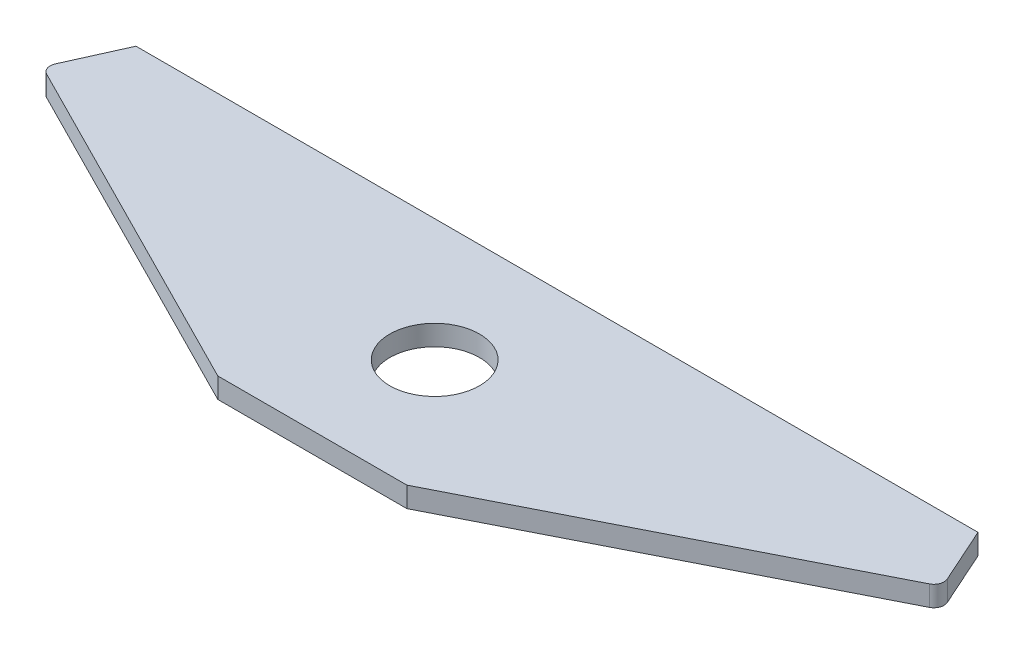
ISO-10303-21;
HEADER;
FILE_DESCRIPTION(('STEP AP214'),'2;1');
FILE_NAME('part.step','',(''),(''),'','','');
FILE_SCHEMA(('AUTOMOTIVE_DESIGN { 1 0 10303 214 1 1 1 1 }'));
ENDSEC;
DATA;
#1=APPLICATION_CONTEXT('core data for automotive mechanical design processes');
#2=APPLICATION_PROTOCOL_DEFINITION('international standard','automotive_design',2000,#1);
#3=PRODUCT_CONTEXT('',#1,'mechanical');
#4=PRODUCT('Part','Part','',(#3));
#5=PRODUCT_RELATED_PRODUCT_CATEGORY('part','',(#4));
#6=PRODUCT_DEFINITION_FORMATION('','',#4);
#7=PRODUCT_DEFINITION_CONTEXT('part definition',#1,'design');
#8=PRODUCT_DEFINITION('design','',#6,#7);
#9=PRODUCT_DEFINITION_SHAPE('','',#8);
#10=(LENGTH_UNIT() NAMED_UNIT(*) SI_UNIT(.MILLI.,.METRE.));
#11=(NAMED_UNIT(*) PLANE_ANGLE_UNIT() SI_UNIT($,.RADIAN.));
#12=(NAMED_UNIT(*) SI_UNIT($,.STERADIAN.) SOLID_ANGLE_UNIT());
#13=UNCERTAINTY_MEASURE_WITH_UNIT(LENGTH_MEASURE(1.E-05),#10,'distance_accuracy_value','');
#14=(GEOMETRIC_REPRESENTATION_CONTEXT(3) GLOBAL_UNCERTAINTY_ASSIGNED_CONTEXT((#13)) GLOBAL_UNIT_ASSIGNED_CONTEXT((#10,
#11,#12)) REPRESENTATION_CONTEXT('',''));
#15=CARTESIAN_POINT('',(0.,0.,0.));
#16=DIRECTION('',(0.,0.,1.));
#17=DIRECTION('',(1.,0.,0.));
#18=AXIS2_PLACEMENT_3D('',#15,#16,#17);
#19=CARTESIAN_POINT('',(224.059047254365,10.,-44.1090575008316));
#20=DIRECTION('',(-0.912159180043909,0.,0.409836101706065));
#21=DIRECTION('',(0.409836101706065,0.,0.912159180043909));
#22=AXIS2_PLACEMENT_3D('',#19,#20,#21);
#23=PLANE('',#22);
#24=DIRECTION('',(-0.409836101706065,0.,-0.912159180043909));
#25=VECTOR('',#24,1.);
#26=CARTESIAN_POINT('',(224.059047254365,0.,-44.1090575008316));
#27=LINE('',#26,#25);
#28=CARTESIAN_POINT('',(236.331683544147,0.,-16.7942411426233));
#29=VERTEX_POINT('',#28);
#30=CARTESIAN_POINT('',(224.059047254365,0.,-44.1090575008316));
#31=VERTEX_POINT('',#30);
#32=EDGE_CURVE('E128',#29,#31,#27,.T.);
#33=ORIENTED_EDGE('',*,*,#32,.T.);
#34=DIRECTION('',(0.,-1.,0.));
#35=VECTOR('',#34,1.);
#36=CARTESIAN_POINT('',(224.059047254365,10.,-44.1090575008316));
#37=LINE('',#36,#35);
#38=CARTESIAN_POINT('',(224.059047254365,10.,-44.1090575008316));
#39=VERTEX_POINT('',#38);
#40=EDGE_CURVE('E11',#39,#31,#37,.T.);
#41=ORIENTED_EDGE('',*,*,#40,.F.);
#42=DIRECTION('',(-0.409836101706065,0.,-0.912159180043909));
#43=VECTOR('',#42,1.);
#44=CARTESIAN_POINT('',(224.059047254365,10.,-44.1090575008316));
#45=LINE('',#44,#43);
#46=CARTESIAN_POINT('',(236.331683544147,10.,-16.7942411426233));
#47=VERTEX_POINT('',#46);
#48=EDGE_CURVE('E144',#47,#39,#45,.T.);
#49=ORIENTED_EDGE('',*,*,#48,.F.);
#50=DIRECTION('',(0.,-1.,0.));
#51=VECTOR('',#50,1.);
#52=CARTESIAN_POINT('',(236.331683544147,10.,-16.7942411426233));
#53=LINE('',#52,#51);
#54=EDGE_CURVE('E124',#47,#29,#53,.T.);
#55=ORIENTED_EDGE('',*,*,#54,.T.);
#56=EDGE_LOOP('',(#33,#41,#49,#55));
#57=FACE_BOUND('',#56,.T.);
#58=ADVANCED_FACE('F33',(#57),#23,.F.);
#59=CARTESIAN_POINT('',(224.059047254365,10.,-44.1090575008316));
#60=DIRECTION('',(0.,0.,1.));
#61=DIRECTION('',(1.,0.,0.));
#62=AXIS2_PLACEMENT_3D('',#59,#60,#61);
#63=PLANE('',#62);
#64=DIRECTION('',(-1.,0.,0.));
#65=VECTOR('',#64,1.);
#66=CARTESIAN_POINT('',(224.059047254365,0.,-44.1090575008316));
#67=LINE('',#66,#65);
#68=CARTESIAN_POINT('',(-188.882980363002,0.,-44.1090575008316));
#69=VERTEX_POINT('',#68);
#70=EDGE_CURVE('E131',#31,#69,#67,.T.);
#71=ORIENTED_EDGE('',*,*,#70,.T.);
#72=DIRECTION('',(0.,-1.,0.));
#73=VECTOR('',#72,1.);
#74=CARTESIAN_POINT('',(-188.882980363002,10.,-44.1090575008316));
#75=LINE('',#74,#73);
#76=CARTESIAN_POINT('',(-188.882980363002,10.,-44.1090575008316));
#77=VERTEX_POINT('',#76);
#78=EDGE_CURVE('E41',#77,#69,#75,.T.);
#79=ORIENTED_EDGE('',*,*,#78,.F.);
#80=DIRECTION('',(-1.,0.,0.));
#81=VECTOR('',#80,1.);
#82=CARTESIAN_POINT('',(224.059047254365,10.,-44.1090575008316));
#83=LINE('',#82,#81);
#84=EDGE_CURVE('E92',#39,#77,#83,.T.);
#85=ORIENTED_EDGE('',*,*,#84,.F.);
#86=ORIENTED_EDGE('',*,*,#40,.T.);
#87=EDGE_LOOP('',(#71,#79,#85,#86));
#88=FACE_BOUND('',#87,.T.);
#89=ADVANCED_FACE('F200',(#88),#63,.F.);
#90=CARTESIAN_POINT('',(-188.882980363002,10.,-44.1090575008316));
#91=DIRECTION('',(0.912159180043909,0.,0.409836101706065));
#92=DIRECTION('',(0.409836101706065,0.,-0.912159180043909));
#93=AXIS2_PLACEMENT_3D('',#90,#91,#92);
#94=PLANE('',#93);
#95=DIRECTION('',(-0.409836101706065,0.,0.912159180043909));
#96=VECTOR('',#95,1.);
#97=CARTESIAN_POINT('',(-188.882980363002,0.,-44.1090575008316));
#98=LINE('',#97,#96);
#99=CARTESIAN_POINT('',(-201.155616652784,0.,-16.7942411426233));
#100=VERTEX_POINT('',#99);
#101=EDGE_CURVE('E134',#69,#100,#98,.T.);
#102=ORIENTED_EDGE('',*,*,#101,.T.);
#103=DIRECTION('',(0.,-1.,0.));
#104=VECTOR('',#103,1.);
#105=CARTESIAN_POINT('',(-201.155616652784,10.,-16.7942411426233));
#106=LINE('',#105,#104);
#107=CARTESIAN_POINT('',(-201.155616652784,10.,-16.7942411426233));
#108=VERTEX_POINT('',#107);
#109=EDGE_CURVE('E151',#108,#100,#106,.T.);
#110=ORIENTED_EDGE('',*,*,#109,.F.);
#111=DIRECTION('',(-0.409836101706065,0.,0.912159180043909));
#112=VECTOR('',#111,1.);
#113=CARTESIAN_POINT('',(-188.882980363002,10.,-44.1090575008316));
#114=LINE('',#113,#112);
#115=EDGE_CURVE('E159',#77,#108,#114,.T.);
#116=ORIENTED_EDGE('',*,*,#115,.F.);
#117=ORIENTED_EDGE('',*,*,#78,.T.);
#118=EDGE_LOOP('',(#102,#110,#116,#117));
#119=FACE_BOUND('',#118,.T.);
#120=ADVANCED_FACE('F157',(#119),#94,.F.);
#121=CARTESIAN_POINT('',(-196.594820752565,10.,-14.7450606340929));
#122=DIRECTION('',(0.,-1.,0.));
#123=DIRECTION('',(0.,0.,-1.));
#124=AXIS2_PLACEMENT_3D('',#121,#122,#123);
#125=CYLINDRICAL_SURFACE('',#124,5.00000000000002);
#126=CARTESIAN_POINT('',(-196.594820752565,0.,-14.7450606340929));
#127=DIRECTION('',(0.,1.,0.));
#128=DIRECTION('',(0.,0.,1.));
#129=AXIS2_PLACEMENT_3D('',#126,#127,#128);
#130=CIRCLE('',#129,5.00000000000002);
#131=CARTESIAN_POINT('',(-198.854573142569,0.,-10.2848454895211));
#132=VERTEX_POINT('',#131);
#133=EDGE_CURVE('E136',#100,#132,#130,.T.);
#134=ORIENTED_EDGE('',*,*,#133,.T.);
#135=DIRECTION('',(0.,-1.,0.));
#136=VECTOR('',#135,1.);
#137=CARTESIAN_POINT('',(-198.854573142569,10.,-10.2848454895211));
#138=LINE('',#137,#136);
#139=CARTESIAN_POINT('',(-198.854573142569,10.,-10.2848454895211));
#140=VERTEX_POINT('',#139);
#141=EDGE_CURVE('E148',#140,#132,#138,.T.);
#142=ORIENTED_EDGE('',*,*,#141,.F.);
#143=CARTESIAN_POINT('',(-196.594820752565,10.,-14.7450606340929));
#144=DIRECTION('',(0.,1.,0.));
#145=DIRECTION('',(0.,0.,1.));
#146=AXIS2_PLACEMENT_3D('',#143,#144,#145);
#147=CIRCLE('',#146,5.00000000000002);
#148=EDGE_CURVE('E171',#108,#140,#147,.T.);
#149=ORIENTED_EDGE('',*,*,#148,.F.);
#150=ORIENTED_EDGE('',*,*,#109,.T.);
#151=EDGE_LOOP('',(#134,#142,#149,#150));
#152=FACE_BOUND('',#151,.T.);
#153=ADVANCED_FACE('F167',(#152),#125,.T.);
#154=CARTESIAN_POINT('',(-198.854573142569,10.,-10.2848454895211));
#155=DIRECTION('',(0.451950478000949,0.,-0.892043028914365));
#156=DIRECTION('',(-0.892043028914365,0.,-0.451950478000949));
#157=AXIS2_PLACEMENT_3D('',#154,#155,#156);
#158=PLANE('',#157);
#159=DIRECTION('',(0.892043028914365,0.,0.451950478000949));
#160=VECTOR('',#159,1.);
#161=CARTESIAN_POINT('',(-198.854573142569,0.,-10.2848454895211));
#162=LINE('',#161,#160);
#163=CARTESIAN_POINT('',(-28.7640108390788,0.,75.8909424991684));
#164=VERTEX_POINT('',#163);
#165=EDGE_CURVE('E138',#132,#164,#162,.T.);
#166=ORIENTED_EDGE('',*,*,#165,.T.);
#167=DIRECTION('',(0.,-1.,0.));
#168=VECTOR('',#167,1.);
#169=CARTESIAN_POINT('',(-28.7640108390788,10.,75.8909424991684));
#170=LINE('',#169,#168);
#171=CARTESIAN_POINT('',(-28.7640108390788,10.,75.8909424991684));
#172=VERTEX_POINT('',#171);
#173=EDGE_CURVE('E119',#172,#164,#170,.T.);
#174=ORIENTED_EDGE('',*,*,#173,.F.);
#175=DIRECTION('',(0.892043028914365,0.,0.451950478000949));
#176=VECTOR('',#175,1.);
#177=CARTESIAN_POINT('',(-198.854573142569,10.,-10.2848454895211));
#178=LINE('',#177,#176);
#179=EDGE_CURVE('E111',#140,#172,#178,.T.);
#180=ORIENTED_EDGE('',*,*,#179,.F.);
#181=ORIENTED_EDGE('',*,*,#141,.T.);
#182=EDGE_LOOP('',(#166,#174,#180,#181));
#183=FACE_BOUND('',#182,.T.);
#184=ADVANCED_FACE('F170',(#183),#158,.F.);
#185=CARTESIAN_POINT('',(17.5880334456815,10.,75.8909424991684));
#186=DIRECTION('',(0.,0.,-1.));
#187=DIRECTION('',(-1.,0.,0.));
#188=AXIS2_PLACEMENT_3D('',#185,#186,#187);
#189=PLANE('',#188);
#190=DIRECTION('',(1.,0.,0.));
#191=VECTOR('',#190,1.);
#192=CARTESIAN_POINT('',(17.5880334456815,0.,75.8909424991684));
#193=LINE('',#192,#191);
#194=CARTESIAN_POINT('',(63.9400777304417,0.,75.8909424991684));
#195=VERTEX_POINT('',#194);
#196=EDGE_CURVE('E118',#164,#195,#193,.T.);
#197=ORIENTED_EDGE('',*,*,#196,.T.);
#198=DIRECTION('',(0.,-1.,0.));
#199=VECTOR('',#198,1.);
#200=CARTESIAN_POINT('',(63.9400777304417,10.,75.8909424991684));
#201=LINE('',#200,#199);
#202=CARTESIAN_POINT('',(63.9400777304417,10.,75.8909424991684));
#203=VERTEX_POINT('',#202);
#204=EDGE_CURVE('E116',#203,#195,#201,.T.);
#205=ORIENTED_EDGE('',*,*,#204,.F.);
#206=DIRECTION('',(1.,0.,0.));
#207=VECTOR('',#206,1.);
#208=CARTESIAN_POINT('',(17.5880334456815,10.,75.8909424991684));
#209=LINE('',#208,#207);
#210=EDGE_CURVE('E105',#172,#203,#209,.T.);
#211=ORIENTED_EDGE('',*,*,#210,.F.);
#212=ORIENTED_EDGE('',*,*,#173,.T.);
#213=EDGE_LOOP('',(#197,#205,#211,#212));
#214=FACE_BOUND('',#213,.T.);
#215=ADVANCED_FACE('F117',(#214),#189,.F.);
#216=CARTESIAN_POINT('',(234.030640033932,10.,-10.2848454895211));
#217=DIRECTION('',(-0.451950478000949,0.,-0.892043028914365));
#218=DIRECTION('',(-0.892043028914365,0.,0.451950478000949));
#219=AXIS2_PLACEMENT_3D('',#216,#217,#218);
#220=PLANE('',#219);
#221=DIRECTION('',(0.892043028914365,0.,-0.451950478000949));
#222=VECTOR('',#221,1.);
#223=CARTESIAN_POINT('',(234.030640033932,0.,-10.2848454895211));
#224=LINE('',#223,#222);
#225=CARTESIAN_POINT('',(234.030640033932,0.,-10.2848454895211));
#226=VERTEX_POINT('',#225);
#227=EDGE_CURVE('E78',#195,#226,#224,.T.);
#228=ORIENTED_EDGE('',*,*,#227,.T.);
#229=DIRECTION('',(0.,-1.,0.));
#230=VECTOR('',#229,1.);
#231=CARTESIAN_POINT('',(234.030640033932,10.,-10.2848454895211));
#232=LINE('',#231,#230);
#233=CARTESIAN_POINT('',(234.030640033932,10.,-10.2848454895211));
#234=VERTEX_POINT('',#233);
#235=EDGE_CURVE('E120',#234,#226,#232,.T.);
#236=ORIENTED_EDGE('',*,*,#235,.F.);
#237=DIRECTION('',(0.892043028914365,0.,-0.451950478000949));
#238=VECTOR('',#237,1.);
#239=CARTESIAN_POINT('',(234.030640033932,10.,-10.2848454895211));
#240=LINE('',#239,#238);
#241=EDGE_CURVE('E109',#203,#234,#240,.T.);
#242=ORIENTED_EDGE('',*,*,#241,.F.);
#243=ORIENTED_EDGE('',*,*,#204,.T.);
#244=EDGE_LOOP('',(#228,#236,#242,#243));
#245=FACE_BOUND('',#244,.T.);
#246=ADVANCED_FACE('F122',(#245),#220,.F.);
#247=CARTESIAN_POINT('',(231.770887643928,10.,-14.7450606340929));
#248=DIRECTION('',(0.,-1.,0.));
#249=DIRECTION('',(0.,0.,-1.));
#250=AXIS2_PLACEMENT_3D('',#247,#248,#249);
#251=CYLINDRICAL_SURFACE('',#250,5.00000000000002);
#252=CARTESIAN_POINT('',(231.770887643928,0.,-14.7450606340929));
#253=DIRECTION('',(0.,1.,0.));
#254=DIRECTION('',(0.,0.,1.));
#255=AXIS2_PLACEMENT_3D('',#252,#253,#254);
#256=CIRCLE('',#255,5.00000000000002);
#257=EDGE_CURVE('E84',#226,#29,#256,.T.);
#258=ORIENTED_EDGE('',*,*,#257,.T.);
#259=ORIENTED_EDGE('',*,*,#54,.F.);
#260=CARTESIAN_POINT('',(231.770887643928,10.,-14.7450606340929));
#261=DIRECTION('',(0.,1.,0.));
#262=DIRECTION('',(0.,0.,1.));
#263=AXIS2_PLACEMENT_3D('',#260,#261,#262);
#264=CIRCLE('',#263,5.00000000000002);
#265=EDGE_CURVE('E49',#234,#47,#264,.T.);
#266=ORIENTED_EDGE('',*,*,#265,.F.);
#267=ORIENTED_EDGE('',*,*,#235,.T.);
#268=EDGE_LOOP('',(#258,#259,#266,#267));
#269=FACE_BOUND('',#268,.T.);
#270=ADVANCED_FACE('F191',(#269),#251,.T.);
#271=CARTESIAN_POINT('',(231.770887643928,10.,-14.7450606340929));
#272=DIRECTION('',(0.,1.,0.));
#273=DIRECTION('',(0.,0.,1.));
#274=AXIS2_PLACEMENT_3D('',#271,#272,#273);
#275=PLANE('',#274);
#276=CARTESIAN_POINT('',(17.5880334456815,10.,15.8909424991684));
#277=DIRECTION('',(0.,1.,0.));
#278=DIRECTION('',(0.,0.,1.));
#279=AXIS2_PLACEMENT_3D('',#276,#277,#278);
#280=CIRCLE('',#279,22.);
#281=CARTESIAN_POINT('',(17.5880334456815,10.,37.8909424991684));
#282=VERTEX_POINT('',#281);
#283=EDGE_CURVE('E177',#282,#282,#280,.T.);
#284=ORIENTED_EDGE('',*,*,#283,.F.);
#285=EDGE_LOOP('',(#284));
#286=FACE_BOUND('',#285,.T.);
#287=ORIENTED_EDGE('',*,*,#48,.T.);
#288=ORIENTED_EDGE('',*,*,#84,.T.);
#289=ORIENTED_EDGE('',*,*,#115,.T.);
#290=ORIENTED_EDGE('',*,*,#148,.T.);
#291=ORIENTED_EDGE('',*,*,#179,.T.);
#292=ORIENTED_EDGE('',*,*,#210,.T.);
#293=ORIENTED_EDGE('',*,*,#241,.T.);
#294=ORIENTED_EDGE('',*,*,#265,.T.);
#295=EDGE_LOOP('',(#287,#288,#289,#290,#291,#292,#293,#294));
#296=FACE_BOUND('',#295,.T.);
#297=ADVANCED_FACE('F107',(#286,#296),#275,.T.);
#298=CARTESIAN_POINT('',(231.770887643928,0.,-14.7450606340929));
#299=DIRECTION('',(0.,1.,0.));
#300=DIRECTION('',(0.,0.,1.));
#301=AXIS2_PLACEMENT_3D('',#298,#299,#300);
#302=PLANE('',#301);
#303=CARTESIAN_POINT('',(17.5880334456815,0.,15.8909424991684));
#304=DIRECTION('',(0.,1.,0.));
#305=DIRECTION('',(0.,0.,1.));
#306=AXIS2_PLACEMENT_3D('',#303,#304,#305);
#307=CIRCLE('',#306,22.);
#308=CARTESIAN_POINT('',(17.5880334456815,0.,37.8909424991684));
#309=VERTEX_POINT('',#308);
#310=EDGE_CURVE('E132',#309,#309,#307,.T.);
#311=ORIENTED_EDGE('',*,*,#310,.T.);
#312=EDGE_LOOP('',(#311));
#313=FACE_BOUND('',#312,.T.);
#314=ORIENTED_EDGE('',*,*,#32,.F.);
#315=ORIENTED_EDGE('',*,*,#257,.F.);
#316=ORIENTED_EDGE('',*,*,#227,.F.);
#317=ORIENTED_EDGE('',*,*,#196,.F.);
#318=ORIENTED_EDGE('',*,*,#165,.F.);
#319=ORIENTED_EDGE('',*,*,#133,.F.);
#320=ORIENTED_EDGE('',*,*,#101,.F.);
#321=ORIENTED_EDGE('',*,*,#70,.F.);
#322=EDGE_LOOP('',(#314,#315,#316,#317,#318,#319,#320,#321));
#323=FACE_BOUND('',#322,.T.);
#324=ADVANCED_FACE('F163',(#313,#323),#302,.F.);
#325=CARTESIAN_POINT('',(17.5880334456815,0.,15.8909424991684));
#326=DIRECTION('',(0.,1.,0.));
#327=DIRECTION('',(0.,0.,1.));
#328=AXIS2_PLACEMENT_3D('',#325,#326,#327);
#329=CYLINDRICAL_SURFACE('',#328,22.);
#330=ORIENTED_EDGE('',*,*,#310,.F.);
#331=EDGE_LOOP('',(#330));
#332=FACE_BOUND('',#331,.T.);
#333=ORIENTED_EDGE('',*,*,#283,.T.);
#334=EDGE_LOOP('',(#333));
#335=FACE_BOUND('',#334,.T.);
#336=ADVANCED_FACE('F184',(#332,#335),#329,.F.);
#337=CLOSED_SHELL('',(#58,#89,#120,#153,#184,#215,#246,#270,#297,#324,#336));
#338=MANIFOLD_SOLID_BREP('B2',#337);
#339=ADVANCED_BREP_SHAPE_REPRESENTATION('',(#18,#338),#14);
#340=SHAPE_DEFINITION_REPRESENTATION(#9,#339);
ENDSEC;
END-ISO-10303-21;
